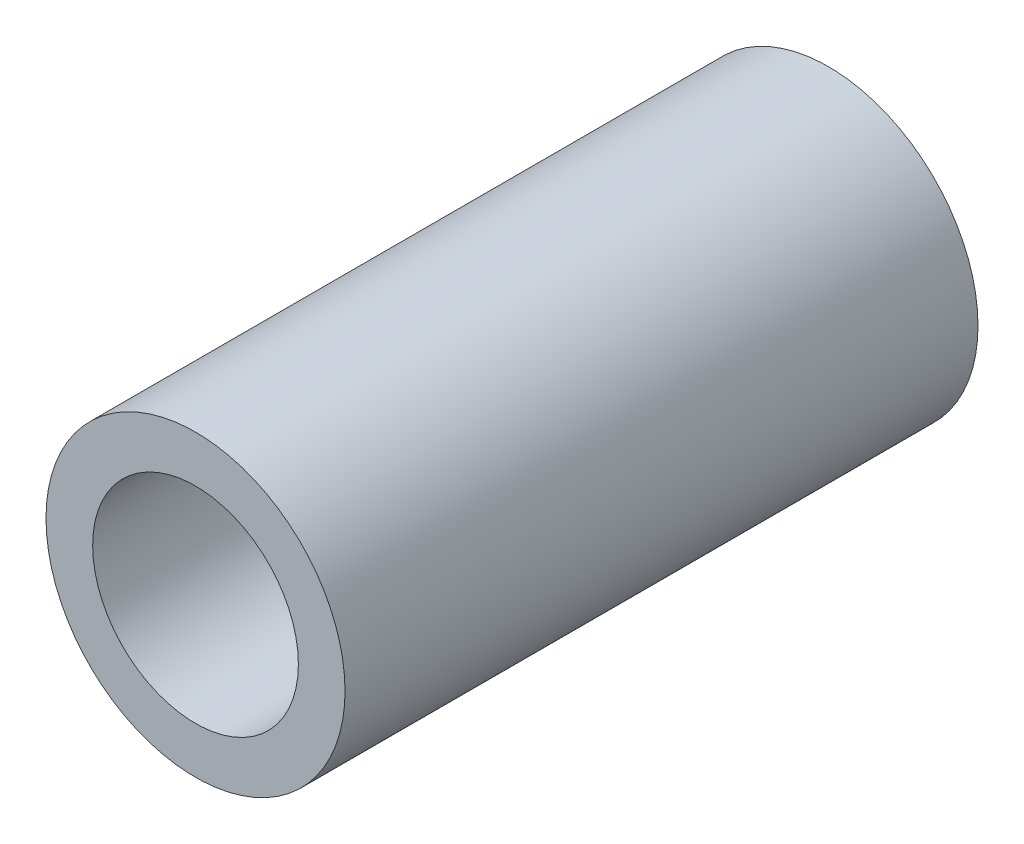
ISO-10303-21;
HEADER;
FILE_DESCRIPTION(('STEP AP214'),'2;1');
FILE_NAME('part.step','',(''),(''),'','','');
FILE_SCHEMA(('AUTOMOTIVE_DESIGN { 1 0 10303 214 1 1 1 1 }'));
ENDSEC;
DATA;
#1=APPLICATION_CONTEXT('core data for automotive mechanical design processes');
#2=APPLICATION_PROTOCOL_DEFINITION('international standard','automotive_design',2000,#1);
#3=PRODUCT_CONTEXT('',#1,'mechanical');
#4=PRODUCT('Part','Part','',(#3));
#5=PRODUCT_RELATED_PRODUCT_CATEGORY('part','',(#4));
#6=PRODUCT_DEFINITION_FORMATION('','',#4);
#7=PRODUCT_DEFINITION_CONTEXT('part definition',#1,'design');
#8=PRODUCT_DEFINITION('design','',#6,#7);
#9=PRODUCT_DEFINITION_SHAPE('','',#8);
#10=(LENGTH_UNIT() NAMED_UNIT(*) SI_UNIT(.MILLI.,.METRE.));
#11=(NAMED_UNIT(*) PLANE_ANGLE_UNIT() SI_UNIT($,.RADIAN.));
#12=(NAMED_UNIT(*) SI_UNIT($,.STERADIAN.) SOLID_ANGLE_UNIT());
#13=UNCERTAINTY_MEASURE_WITH_UNIT(LENGTH_MEASURE(1.E-05),#10,'distance_accuracy_value','');
#14=(GEOMETRIC_REPRESENTATION_CONTEXT(3) GLOBAL_UNCERTAINTY_ASSIGNED_CONTEXT((#13)) GLOBAL_UNIT_ASSIGNED_CONTEXT((#10,
#11,#12)) REPRESENTATION_CONTEXT('',''));
#15=CARTESIAN_POINT('',(0.,0.,0.));
#16=DIRECTION('',(0.,0.,1.));
#17=DIRECTION('',(1.,0.,0.));
#18=AXIS2_PLACEMENT_3D('',#15,#16,#17);
#19=CARTESIAN_POINT('',(0.,0.,-12.7));
#20=DIRECTION('',(0.,0.,1.));
#21=DIRECTION('',(1.,0.,0.));
#22=AXIS2_PLACEMENT_3D('',#19,#20,#21);
#23=CYLINDRICAL_SURFACE('',#22,6.);
#24=CARTESIAN_POINT('',(0.,0.,-12.7));
#25=DIRECTION('',(0.,0.,1.));
#26=DIRECTION('',(1.,0.,0.));
#27=AXIS2_PLACEMENT_3D('',#24,#25,#26);
#28=CIRCLE('',#27,6.);
#29=CARTESIAN_POINT('',(6.,0.,-12.7));
#30=VERTEX_POINT('',#29);
#31=EDGE_CURVE('E10',#30,#30,#28,.T.);
#32=ORIENTED_EDGE('',*,*,#31,.T.);
#33=EDGE_LOOP('',(#32));
#34=FACE_BOUND('',#33,.T.);
#35=CARTESIAN_POINT('',(0.,0.,12.7));
#36=DIRECTION('',(0.,0.,1.));
#37=DIRECTION('',(1.,0.,0.));
#38=AXIS2_PLACEMENT_3D('',#35,#36,#37);
#39=CIRCLE('',#38,6.);
#40=CARTESIAN_POINT('',(6.,0.,12.7));
#41=VERTEX_POINT('',#40);
#42=EDGE_CURVE('E42',#41,#41,#39,.T.);
#43=ORIENTED_EDGE('',*,*,#42,.F.);
#44=EDGE_LOOP('',(#43));
#45=FACE_BOUND('',#44,.T.);
#46=ADVANCED_FACE('F39',(#34,#45),#23,.T.);
#47=CARTESIAN_POINT('',(0.,0.,-12.7));
#48=DIRECTION('',(0.,0.,1.));
#49=DIRECTION('',(1.,0.,0.));
#50=AXIS2_PLACEMENT_3D('',#47,#48,#49);
#51=PLANE('',#50);
#52=CARTESIAN_POINT('',(0.,0.,-12.7));
#53=DIRECTION('',(0.,0.,1.));
#54=DIRECTION('',(1.,0.,0.));
#55=AXIS2_PLACEMENT_3D('',#52,#53,#54);
#56=CIRCLE('',#55,4.12770307953571);
#57=CARTESIAN_POINT('',(4.12770307953571,0.,-12.7));
#58=VERTEX_POINT('',#57);
#59=EDGE_CURVE('E49',#58,#58,#56,.T.);
#60=ORIENTED_EDGE('',*,*,#59,.T.);
#61=EDGE_LOOP('',(#60));
#62=FACE_BOUND('',#61,.T.);
#63=ORIENTED_EDGE('',*,*,#31,.F.);
#64=EDGE_LOOP('',(#63));
#65=FACE_BOUND('',#64,.T.);
#66=ADVANCED_FACE('F57',(#62,#65),#51,.F.);
#67=CARTESIAN_POINT('',(0.,0.,12.7));
#68=DIRECTION('',(0.,0.,1.));
#69=DIRECTION('',(1.,0.,0.));
#70=AXIS2_PLACEMENT_3D('',#67,#68,#69);
#71=PLANE('',#70);
#72=CARTESIAN_POINT('',(0.,0.,12.7));
#73=DIRECTION('',(0.,0.,1.));
#74=DIRECTION('',(1.,0.,0.));
#75=AXIS2_PLACEMENT_3D('',#72,#73,#74);
#76=CIRCLE('',#75,4.12770307953571);
#77=CARTESIAN_POINT('',(4.12770307953571,0.,12.7));
#78=VERTEX_POINT('',#77);
#79=EDGE_CURVE('E51',#78,#78,#76,.T.);
#80=ORIENTED_EDGE('',*,*,#79,.F.);
#81=EDGE_LOOP('',(#80));
#82=FACE_BOUND('',#81,.T.);
#83=ORIENTED_EDGE('',*,*,#42,.T.);
#84=EDGE_LOOP('',(#83));
#85=FACE_BOUND('',#84,.T.);
#86=ADVANCED_FACE('F63',(#82,#85),#71,.T.);
#87=CARTESIAN_POINT('',(0.,0.,-12.7));
#88=DIRECTION('',(0.,0.,1.));
#89=DIRECTION('',(1.,0.,0.));
#90=AXIS2_PLACEMENT_3D('',#87,#88,#89);
#91=CYLINDRICAL_SURFACE('',#90,4.12770307953571);
#92=ORIENTED_EDGE('',*,*,#59,.F.);
#93=EDGE_LOOP('',(#92));
#94=FACE_BOUND('',#93,.T.);
#95=ORIENTED_EDGE('',*,*,#79,.T.);
#96=EDGE_LOOP('',(#95));
#97=FACE_BOUND('',#96,.T.);
#98=ADVANCED_FACE('F60',(#94,#97),#91,.F.);
#99=CLOSED_SHELL('',(#46,#66,#86,#98));
#100=MANIFOLD_SOLID_BREP('B2',#99);
#101=ADVANCED_BREP_SHAPE_REPRESENTATION('',(#18,#100),#14);
#102=SHAPE_DEFINITION_REPRESENTATION(#9,#101);
ENDSEC;
END-ISO-10303-21;
